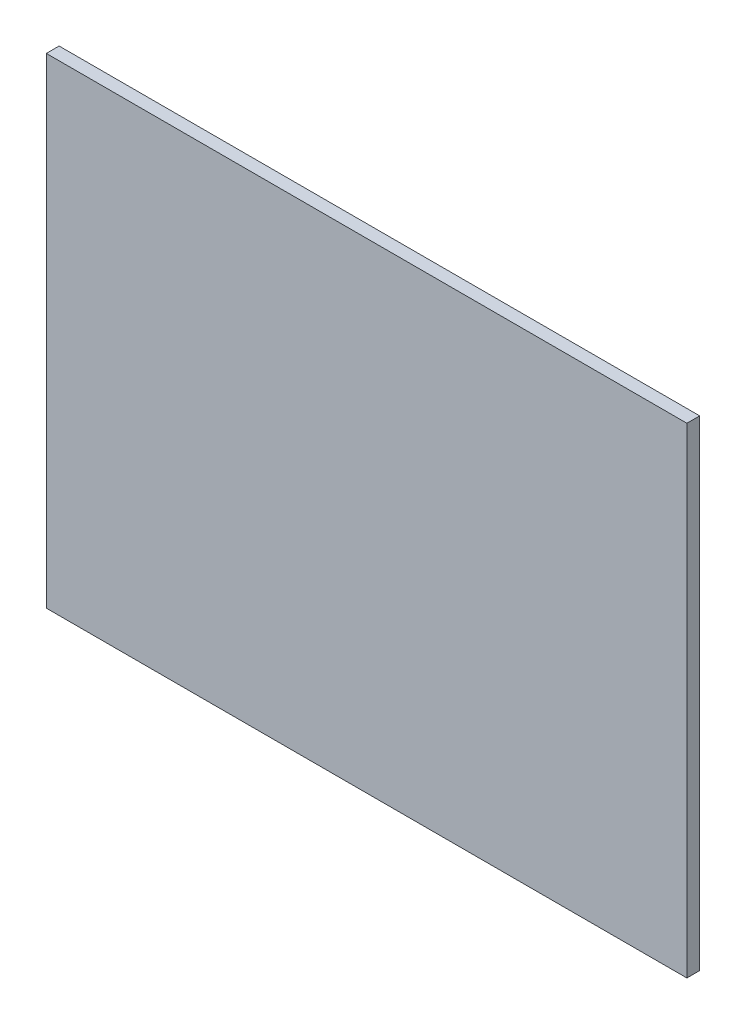
ISO-10303-21;
HEADER;
FILE_DESCRIPTION(('STEP AP214'),'2;1');
FILE_NAME('part.step','',(''),(''),'','','');
FILE_SCHEMA(('AUTOMOTIVE_DESIGN { 1 0 10303 214 1 1 1 1 }'));
ENDSEC;
DATA;
#1=APPLICATION_CONTEXT('core data for automotive mechanical design processes');
#2=APPLICATION_PROTOCOL_DEFINITION('international standard','automotive_design',2000,#1);
#3=PRODUCT_CONTEXT('',#1,'mechanical');
#4=PRODUCT('Part','Part','',(#3));
#5=PRODUCT_RELATED_PRODUCT_CATEGORY('part','',(#4));
#6=PRODUCT_DEFINITION_FORMATION('','',#4);
#7=PRODUCT_DEFINITION_CONTEXT('part definition',#1,'design');
#8=PRODUCT_DEFINITION('design','',#6,#7);
#9=PRODUCT_DEFINITION_SHAPE('','',#8);
#10=(LENGTH_UNIT() NAMED_UNIT(*) SI_UNIT(.MILLI.,.METRE.));
#11=(NAMED_UNIT(*) PLANE_ANGLE_UNIT() SI_UNIT($,.RADIAN.));
#12=(NAMED_UNIT(*) SI_UNIT($,.STERADIAN.) SOLID_ANGLE_UNIT());
#13=UNCERTAINTY_MEASURE_WITH_UNIT(LENGTH_MEASURE(1.E-05),#10,'distance_accuracy_value','');
#14=(GEOMETRIC_REPRESENTATION_CONTEXT(3) GLOBAL_UNCERTAINTY_ASSIGNED_CONTEXT((#13)) GLOBAL_UNIT_ASSIGNED_CONTEXT((#10,
#11,#12)) REPRESENTATION_CONTEXT('',''));
#15=CARTESIAN_POINT('',(0.,0.,0.));
#16=DIRECTION('',(0.,0.,1.));
#17=DIRECTION('',(1.,0.,0.));
#18=AXIS2_PLACEMENT_3D('',#15,#16,#17);
#19=CARTESIAN_POINT('',(100.,75.,4.));
#20=DIRECTION('',(-1.,0.,0.));
#21=DIRECTION('',(0.,-1.,0.));
#22=AXIS2_PLACEMENT_3D('',#19,#20,#21);
#23=PLANE('',#22);
#24=DIRECTION('',(0.,1.,0.));
#25=VECTOR('',#24,1.);
#26=CARTESIAN_POINT('',(100.,75.,0.));
#27=LINE('',#26,#25);
#28=CARTESIAN_POINT('',(100.,-75.,0.));
#29=VERTEX_POINT('',#28);
#30=CARTESIAN_POINT('',(100.,75.,0.));
#31=VERTEX_POINT('',#30);
#32=EDGE_CURVE('E96',#29,#31,#27,.T.);
#33=ORIENTED_EDGE('',*,*,#32,.T.);
#34=DIRECTION('',(0.,0.,-1.));
#35=VECTOR('',#34,1.);
#36=CARTESIAN_POINT('',(100.,75.,4.));
#37=LINE('',#36,#35);
#38=CARTESIAN_POINT('',(100.,75.,4.));
#39=VERTEX_POINT('',#38);
#40=EDGE_CURVE('E11',#39,#31,#37,.T.);
#41=ORIENTED_EDGE('',*,*,#40,.F.);
#42=DIRECTION('',(0.,1.,0.));
#43=VECTOR('',#42,1.);
#44=CARTESIAN_POINT('',(100.,75.,4.));
#45=LINE('',#44,#43);
#46=CARTESIAN_POINT('',(100.,-75.,4.));
#47=VERTEX_POINT('',#46);
#48=EDGE_CURVE('E84',#47,#39,#45,.T.);
#49=ORIENTED_EDGE('',*,*,#48,.F.);
#50=DIRECTION('',(0.,0.,-1.));
#51=VECTOR('',#50,1.);
#52=CARTESIAN_POINT('',(100.,-75.,4.));
#53=LINE('',#52,#51);
#54=EDGE_CURVE('E92',#47,#29,#53,.T.);
#55=ORIENTED_EDGE('',*,*,#54,.T.);
#56=EDGE_LOOP('',(#33,#41,#49,#55));
#57=FACE_BOUND('',#56,.T.);
#58=ADVANCED_FACE('F33',(#57),#23,.F.);
#59=CARTESIAN_POINT('',(-100.,75.,4.));
#60=DIRECTION('',(0.,-1.,0.));
#61=DIRECTION('',(0.,0.,-1.));
#62=AXIS2_PLACEMENT_3D('',#59,#60,#61);
#63=PLANE('',#62);
#64=DIRECTION('',(-1.,0.,0.));
#65=VECTOR('',#64,1.);
#66=CARTESIAN_POINT('',(-100.,75.,0.));
#67=LINE('',#66,#65);
#68=CARTESIAN_POINT('',(-100.,75.,0.));
#69=VERTEX_POINT('',#68);
#70=EDGE_CURVE('E88',#31,#69,#67,.T.);
#71=ORIENTED_EDGE('',*,*,#70,.T.);
#72=DIRECTION('',(0.,0.,-1.));
#73=VECTOR('',#72,1.);
#74=CARTESIAN_POINT('',(-100.,75.,4.));
#75=LINE('',#74,#73);
#76=CARTESIAN_POINT('',(-100.,75.,4.));
#77=VERTEX_POINT('',#76);
#78=EDGE_CURVE('E41',#77,#69,#75,.T.);
#79=ORIENTED_EDGE('',*,*,#78,.F.);
#80=DIRECTION('',(-1.,0.,0.));
#81=VECTOR('',#80,1.);
#82=CARTESIAN_POINT('',(-100.,75.,4.));
#83=LINE('',#82,#81);
#84=EDGE_CURVE('E79',#39,#77,#83,.T.);
#85=ORIENTED_EDGE('',*,*,#84,.F.);
#86=ORIENTED_EDGE('',*,*,#40,.T.);
#87=EDGE_LOOP('',(#71,#79,#85,#86));
#88=FACE_BOUND('',#87,.T.);
#89=ADVANCED_FACE('F87',(#88),#63,.F.);
#90=CARTESIAN_POINT('',(-100.,75.,4.));
#91=DIRECTION('',(1.,0.,0.));
#92=DIRECTION('',(0.,1.,0.));
#93=AXIS2_PLACEMENT_3D('',#90,#91,#92);
#94=PLANE('',#93);
#95=DIRECTION('',(0.,-1.,0.));
#96=VECTOR('',#95,1.);
#97=CARTESIAN_POINT('',(-100.,75.,0.));
#98=LINE('',#97,#96);
#99=CARTESIAN_POINT('',(-100.,-75.,0.));
#100=VERTEX_POINT('',#99);
#101=EDGE_CURVE('E66',#69,#100,#98,.T.);
#102=ORIENTED_EDGE('',*,*,#101,.T.);
#103=DIRECTION('',(0.,0.,-1.));
#104=VECTOR('',#103,1.);
#105=CARTESIAN_POINT('',(-100.,-75.,4.));
#106=LINE('',#105,#104);
#107=CARTESIAN_POINT('',(-100.,-75.,4.));
#108=VERTEX_POINT('',#107);
#109=EDGE_CURVE('E89',#108,#100,#106,.T.);
#110=ORIENTED_EDGE('',*,*,#109,.F.);
#111=DIRECTION('',(0.,-1.,0.));
#112=VECTOR('',#111,1.);
#113=CARTESIAN_POINT('',(-100.,75.,4.));
#114=LINE('',#113,#112);
#115=EDGE_CURVE('E82',#77,#108,#114,.T.);
#116=ORIENTED_EDGE('',*,*,#115,.F.);
#117=ORIENTED_EDGE('',*,*,#78,.T.);
#118=EDGE_LOOP('',(#102,#110,#116,#117));
#119=FACE_BOUND('',#118,.T.);
#120=ADVANCED_FACE('F90',(#119),#94,.F.);
#121=CARTESIAN_POINT('',(-100.,-75.,4.));
#122=DIRECTION('',(0.,1.,0.));
#123=DIRECTION('',(0.,0.,1.));
#124=AXIS2_PLACEMENT_3D('',#121,#122,#123);
#125=PLANE('',#124);
#126=DIRECTION('',(1.,0.,0.));
#127=VECTOR('',#126,1.);
#128=CARTESIAN_POINT('',(-100.,-75.,0.));
#129=LINE('',#128,#127);
#130=EDGE_CURVE('E72',#100,#29,#129,.T.);
#131=ORIENTED_EDGE('',*,*,#130,.T.);
#132=ORIENTED_EDGE('',*,*,#54,.F.);
#133=DIRECTION('',(1.,0.,0.));
#134=VECTOR('',#133,1.);
#135=CARTESIAN_POINT('',(-100.,-75.,4.));
#136=LINE('',#135,#134);
#137=EDGE_CURVE('E49',#108,#47,#136,.T.);
#138=ORIENTED_EDGE('',*,*,#137,.F.);
#139=ORIENTED_EDGE('',*,*,#109,.T.);
#140=EDGE_LOOP('',(#131,#132,#138,#139));
#141=FACE_BOUND('',#140,.T.);
#142=ADVANCED_FACE('F103',(#141),#125,.F.);
#143=CARTESIAN_POINT('',(0.,0.,4.));
#144=DIRECTION('',(0.,0.,1.));
#145=DIRECTION('',(1.,0.,0.));
#146=AXIS2_PLACEMENT_3D('',#143,#144,#145);
#147=PLANE('',#146);
#148=ORIENTED_EDGE('',*,*,#48,.T.);
#149=ORIENTED_EDGE('',*,*,#84,.T.);
#150=ORIENTED_EDGE('',*,*,#115,.T.);
#151=ORIENTED_EDGE('',*,*,#137,.T.);
#152=EDGE_LOOP('',(#148,#149,#150,#151));
#153=FACE_BOUND('',#152,.T.);
#154=ADVANCED_FACE('F80',(#153),#147,.T.);
#155=CARTESIAN_POINT('',(0.,0.,0.));
#156=DIRECTION('',(0.,0.,1.));
#157=DIRECTION('',(1.,0.,0.));
#158=AXIS2_PLACEMENT_3D('',#155,#156,#157);
#159=PLANE('',#158);
#160=ORIENTED_EDGE('',*,*,#32,.F.);
#161=ORIENTED_EDGE('',*,*,#130,.F.);
#162=ORIENTED_EDGE('',*,*,#101,.F.);
#163=ORIENTED_EDGE('',*,*,#70,.F.);
#164=EDGE_LOOP('',(#160,#161,#162,#163));
#165=FACE_BOUND('',#164,.T.);
#166=ADVANCED_FACE('F106',(#165),#159,.F.);
#167=CLOSED_SHELL('',(#58,#89,#120,#142,#154,#166));
#168=MANIFOLD_SOLID_BREP('B2',#167);
#169=ADVANCED_BREP_SHAPE_REPRESENTATION('',(#18,#168),#14);
#170=SHAPE_DEFINITION_REPRESENTATION(#9,#169);
ENDSEC;
END-ISO-10303-21;
